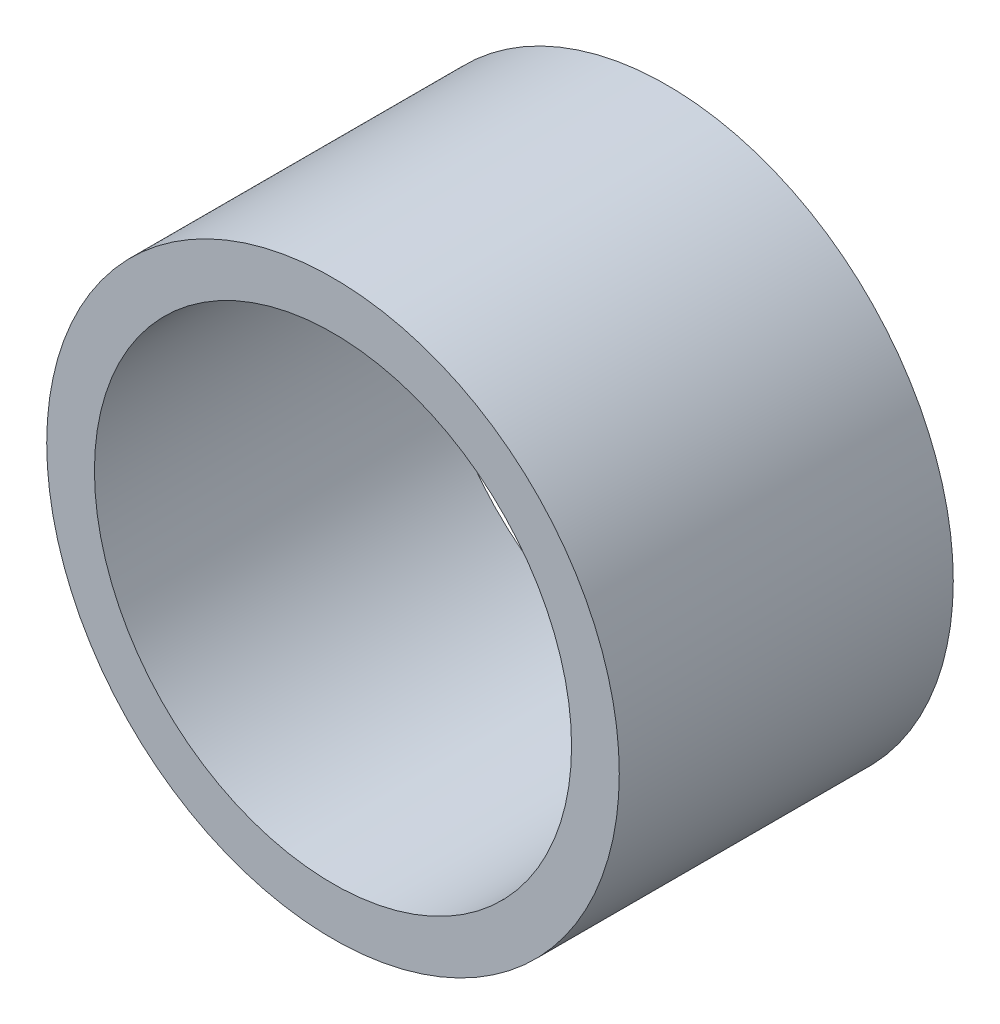
ISO-10303-21;
HEADER;
FILE_DESCRIPTION(('STEP AP214'),'2;1');
FILE_NAME('part.step','',(''),(''),'','','');
FILE_SCHEMA(('AUTOMOTIVE_DESIGN { 1 0 10303 214 1 1 1 1 }'));
ENDSEC;
DATA;
#1=APPLICATION_CONTEXT('core data for automotive mechanical design processes');
#2=APPLICATION_PROTOCOL_DEFINITION('international standard','automotive_design',2000,#1);
#3=PRODUCT_CONTEXT('',#1,'mechanical');
#4=PRODUCT('Part','Part','',(#3));
#5=PRODUCT_RELATED_PRODUCT_CATEGORY('part','',(#4));
#6=PRODUCT_DEFINITION_FORMATION('','',#4);
#7=PRODUCT_DEFINITION_CONTEXT('part definition',#1,'design');
#8=PRODUCT_DEFINITION('design','',#6,#7);
#9=PRODUCT_DEFINITION_SHAPE('','',#8);
#10=(LENGTH_UNIT() NAMED_UNIT(*) SI_UNIT(.MILLI.,.METRE.));
#11=(NAMED_UNIT(*) PLANE_ANGLE_UNIT() SI_UNIT($,.RADIAN.));
#12=(NAMED_UNIT(*) SI_UNIT($,.STERADIAN.) SOLID_ANGLE_UNIT());
#13=UNCERTAINTY_MEASURE_WITH_UNIT(LENGTH_MEASURE(1.E-05),#10,'distance_accuracy_value','');
#14=(GEOMETRIC_REPRESENTATION_CONTEXT(3) GLOBAL_UNCERTAINTY_ASSIGNED_CONTEXT((#13)) GLOBAL_UNIT_ASSIGNED_CONTEXT((#10,
#11,#12)) REPRESENTATION_CONTEXT('',''));
#15=CARTESIAN_POINT('',(0.,0.,0.));
#16=DIRECTION('',(0.,0.,1.));
#17=DIRECTION('',(1.,0.,0.));
#18=AXIS2_PLACEMENT_3D('',#15,#16,#17);
#19=CARTESIAN_POINT('',(0.,0.,14.));
#20=DIRECTION('',(0.,0.,1.));
#21=DIRECTION('',(1.,0.,0.));
#22=AXIS2_PLACEMENT_3D('',#19,#20,#21);
#23=PLANE('',#22);
#24=CARTESIAN_POINT('',(0.,0.,14.));
#25=DIRECTION('',(0.,0.,1.));
#26=DIRECTION('',(1.,0.,0.));
#27=AXIS2_PLACEMENT_3D('',#24,#25,#26);
#28=CIRCLE('',#27,12.);
#29=CARTESIAN_POINT('',(12.,0.,14.));
#30=VERTEX_POINT('',#29);
#31=EDGE_CURVE('E10',#30,#30,#28,.T.);
#32=ORIENTED_EDGE('',*,*,#31,.T.);
#33=EDGE_LOOP('',(#32));
#34=FACE_BOUND('',#33,.T.);
#35=CARTESIAN_POINT('',(0.,0.,14.));
#36=DIRECTION('',(0.,0.,1.));
#37=DIRECTION('',(1.,0.,0.));
#38=AXIS2_PLACEMENT_3D('',#35,#36,#37);
#39=CIRCLE('',#38,10.);
#40=CARTESIAN_POINT('',(10.,0.,14.));
#41=VERTEX_POINT('',#40);
#42=EDGE_CURVE('E45',#41,#41,#39,.T.);
#43=ORIENTED_EDGE('',*,*,#42,.F.);
#44=EDGE_LOOP('',(#43));
#45=FACE_BOUND('',#44,.T.);
#46=ADVANCED_FACE('F34',(#34,#45),#23,.T.);
#47=CARTESIAN_POINT('',(0.,0.,0.));
#48=DIRECTION('',(0.,0.,1.));
#49=DIRECTION('',(1.,0.,0.));
#50=AXIS2_PLACEMENT_3D('',#47,#48,#49);
#51=PLANE('',#50);
#52=CARTESIAN_POINT('',(0.,0.,0.));
#53=DIRECTION('',(0.,0.,1.));
#54=DIRECTION('',(1.,0.,0.));
#55=AXIS2_PLACEMENT_3D('',#52,#53,#54);
#56=CIRCLE('',#55,12.);
#57=CARTESIAN_POINT('',(12.,0.,0.));
#58=VERTEX_POINT('',#57);
#59=EDGE_CURVE('E41',#58,#58,#56,.T.);
#60=ORIENTED_EDGE('',*,*,#59,.F.);
#61=EDGE_LOOP('',(#60));
#62=FACE_BOUND('',#61,.T.);
#63=CARTESIAN_POINT('',(0.,0.,0.));
#64=DIRECTION('',(0.,0.,1.));
#65=DIRECTION('',(1.,0.,0.));
#66=AXIS2_PLACEMENT_3D('',#63,#64,#65);
#67=CIRCLE('',#66,10.);
#68=CARTESIAN_POINT('',(10.,0.,0.));
#69=VERTEX_POINT('',#68);
#70=EDGE_CURVE('E49',#69,#69,#67,.T.);
#71=ORIENTED_EDGE('',*,*,#70,.T.);
#72=EDGE_LOOP('',(#71));
#73=FACE_BOUND('',#72,.T.);
#74=ADVANCED_FACE('F55',(#62,#73),#51,.F.);
#75=CARTESIAN_POINT('',(0.,0.,14.));
#76=DIRECTION('',(0.,0.,-1.));
#77=DIRECTION('',(-1.,0.,0.));
#78=AXIS2_PLACEMENT_3D('',#75,#76,#77);
#79=CYLINDRICAL_SURFACE('',#78,12.);
#80=ORIENTED_EDGE('',*,*,#31,.F.);
#81=EDGE_LOOP('',(#80));
#82=FACE_BOUND('',#81,.T.);
#83=ORIENTED_EDGE('',*,*,#59,.T.);
#84=EDGE_LOOP('',(#83));
#85=FACE_BOUND('',#84,.T.);
#86=ADVANCED_FACE('F36',(#82,#85),#79,.T.);
#87=CARTESIAN_POINT('',(0.,0.,14.));
#88=DIRECTION('',(0.,0.,-1.));
#89=DIRECTION('',(-1.,0.,0.));
#90=AXIS2_PLACEMENT_3D('',#87,#88,#89);
#91=CYLINDRICAL_SURFACE('',#90,10.);
#92=ORIENTED_EDGE('',*,*,#42,.T.);
#93=EDGE_LOOP('',(#92));
#94=FACE_BOUND('',#93,.T.);
#95=ORIENTED_EDGE('',*,*,#70,.F.);
#96=EDGE_LOOP('',(#95));
#97=FACE_BOUND('',#96,.T.);
#98=ADVANCED_FACE('F57',(#94,#97),#91,.F.);
#99=CLOSED_SHELL('',(#46,#74,#86,#98));
#100=MANIFOLD_SOLID_BREP('B2',#99);
#101=ADVANCED_BREP_SHAPE_REPRESENTATION('',(#18,#100),#14);
#102=SHAPE_DEFINITION_REPRESENTATION(#9,#101);
ENDSEC;
END-ISO-10303-21;
